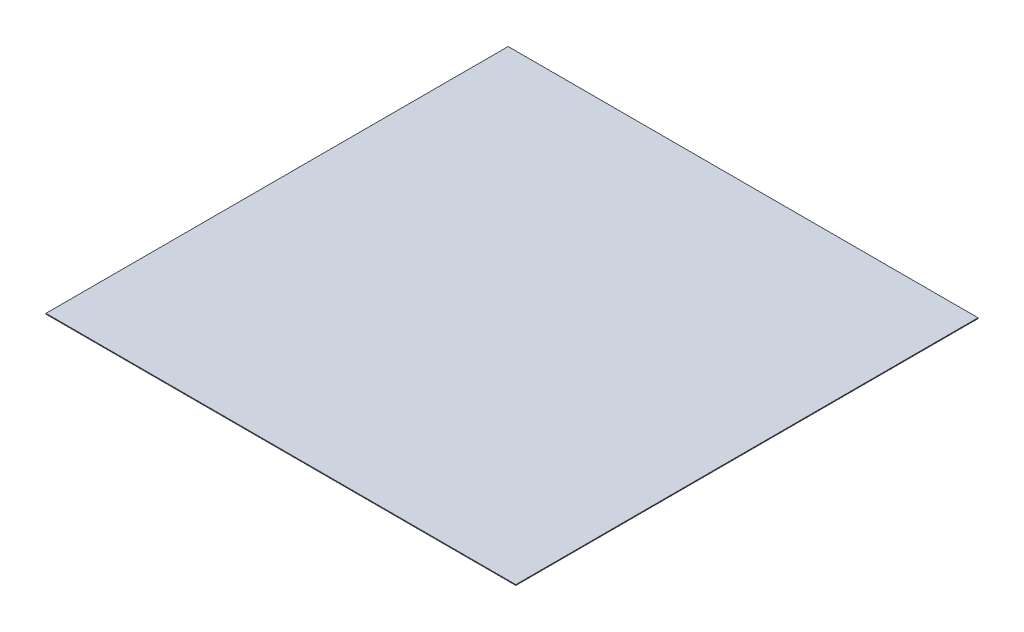
ISO-10303-21;
HEADER;
FILE_DESCRIPTION(('STEP AP214'),'2;1');
FILE_NAME('part.step','',(''),(''),'','','');
FILE_SCHEMA(('AUTOMOTIVE_DESIGN { 1 0 10303 214 1 1 1 1 }'));
ENDSEC;
DATA;
#1=APPLICATION_CONTEXT('core data for automotive mechanical design processes');
#2=APPLICATION_PROTOCOL_DEFINITION('international standard','automotive_design',2000,#1);
#3=PRODUCT_CONTEXT('',#1,'mechanical');
#4=PRODUCT('Part','Part','',(#3));
#5=PRODUCT_RELATED_PRODUCT_CATEGORY('part','',(#4));
#6=PRODUCT_DEFINITION_FORMATION('','',#4);
#7=PRODUCT_DEFINITION_CONTEXT('part definition',#1,'design');
#8=PRODUCT_DEFINITION('design','',#6,#7);
#9=PRODUCT_DEFINITION_SHAPE('','',#8);
#10=(LENGTH_UNIT() NAMED_UNIT(*) SI_UNIT(.MILLI.,.METRE.));
#11=(NAMED_UNIT(*) PLANE_ANGLE_UNIT() SI_UNIT($,.RADIAN.));
#12=(NAMED_UNIT(*) SI_UNIT($,.STERADIAN.) SOLID_ANGLE_UNIT());
#13=UNCERTAINTY_MEASURE_WITH_UNIT(LENGTH_MEASURE(1.E-05),#10,'distance_accuracy_value','');
#14=(GEOMETRIC_REPRESENTATION_CONTEXT(3) GLOBAL_UNCERTAINTY_ASSIGNED_CONTEXT((#13)) GLOBAL_UNIT_ASSIGNED_CONTEXT((#10,
#11,#12)) REPRESENTATION_CONTEXT('',''));
#15=CARTESIAN_POINT('',(0.,0.,0.));
#16=DIRECTION('',(0.,0.,1.));
#17=DIRECTION('',(1.,0.,0.));
#18=AXIS2_PLACEMENT_3D('',#15,#16,#17);
#19=CARTESIAN_POINT('',(610.,2.,600.));
#20=DIRECTION('',(-1.,0.,0.));
#21=DIRECTION('',(0.,0.,1.));
#22=AXIS2_PLACEMENT_3D('',#19,#20,#21);
#23=PLANE('',#22);
#24=DIRECTION('',(0.,0.,-1.));
#25=VECTOR('',#24,1.);
#26=CARTESIAN_POINT('',(610.,0.,600.));
#27=LINE('',#26,#25);
#28=CARTESIAN_POINT('',(610.,0.,600.));
#29=VERTEX_POINT('',#28);
#30=CARTESIAN_POINT('',(610.,0.,-600.));
#31=VERTEX_POINT('',#30);
#32=EDGE_CURVE('E96',#29,#31,#27,.T.);
#33=ORIENTED_EDGE('',*,*,#32,.T.);
#34=DIRECTION('',(0.,-1.,0.));
#35=VECTOR('',#34,1.);
#36=CARTESIAN_POINT('',(610.,2.,-600.));
#37=LINE('',#36,#35);
#38=CARTESIAN_POINT('',(610.,2.,-600.));
#39=VERTEX_POINT('',#38);
#40=EDGE_CURVE('E11',#39,#31,#37,.T.);
#41=ORIENTED_EDGE('',*,*,#40,.F.);
#42=DIRECTION('',(0.,0.,-1.));
#43=VECTOR('',#42,1.);
#44=CARTESIAN_POINT('',(610.,2.,600.));
#45=LINE('',#44,#43);
#46=CARTESIAN_POINT('',(610.,2.,600.));
#47=VERTEX_POINT('',#46);
#48=EDGE_CURVE('E84',#47,#39,#45,.T.);
#49=ORIENTED_EDGE('',*,*,#48,.F.);
#50=DIRECTION('',(0.,-1.,0.));
#51=VECTOR('',#50,1.);
#52=CARTESIAN_POINT('',(610.,2.,600.));
#53=LINE('',#52,#51);
#54=EDGE_CURVE('E92',#47,#29,#53,.T.);
#55=ORIENTED_EDGE('',*,*,#54,.T.);
#56=EDGE_LOOP('',(#33,#41,#49,#55));
#57=FACE_BOUND('',#56,.T.);
#58=ADVANCED_FACE('F33',(#57),#23,.F.);
#59=CARTESIAN_POINT('',(-610.,2.,-600.));
#60=DIRECTION('',(0.,0.,1.));
#61=DIRECTION('',(1.,0.,0.));
#62=AXIS2_PLACEMENT_3D('',#59,#60,#61);
#63=PLANE('',#62);
#64=DIRECTION('',(-1.,0.,0.));
#65=VECTOR('',#64,1.);
#66=CARTESIAN_POINT('',(-610.,0.,-600.));
#67=LINE('',#66,#65);
#68=CARTESIAN_POINT('',(-610.,0.,-600.));
#69=VERTEX_POINT('',#68);
#70=EDGE_CURVE('E88',#31,#69,#67,.T.);
#71=ORIENTED_EDGE('',*,*,#70,.T.);
#72=DIRECTION('',(0.,-1.,0.));
#73=VECTOR('',#72,1.);
#74=CARTESIAN_POINT('',(-610.,2.,-600.));
#75=LINE('',#74,#73);
#76=CARTESIAN_POINT('',(-610.,2.,-600.));
#77=VERTEX_POINT('',#76);
#78=EDGE_CURVE('E41',#77,#69,#75,.T.);
#79=ORIENTED_EDGE('',*,*,#78,.F.);
#80=DIRECTION('',(-1.,0.,0.));
#81=VECTOR('',#80,1.);
#82=CARTESIAN_POINT('',(-610.,2.,-600.));
#83=LINE('',#82,#81);
#84=EDGE_CURVE('E79',#39,#77,#83,.T.);
#85=ORIENTED_EDGE('',*,*,#84,.F.);
#86=ORIENTED_EDGE('',*,*,#40,.T.);
#87=EDGE_LOOP('',(#71,#79,#85,#86));
#88=FACE_BOUND('',#87,.T.);
#89=ADVANCED_FACE('F87',(#88),#63,.F.);
#90=CARTESIAN_POINT('',(-610.,2.,600.));
#91=DIRECTION('',(1.,0.,0.));
#92=DIRECTION('',(0.,0.,-1.));
#93=AXIS2_PLACEMENT_3D('',#90,#91,#92);
#94=PLANE('',#93);
#95=DIRECTION('',(0.,0.,1.));
#96=VECTOR('',#95,1.);
#97=CARTESIAN_POINT('',(-610.,0.,600.));
#98=LINE('',#97,#96);
#99=CARTESIAN_POINT('',(-610.,0.,600.));
#100=VERTEX_POINT('',#99);
#101=EDGE_CURVE('E66',#69,#100,#98,.T.);
#102=ORIENTED_EDGE('',*,*,#101,.T.);
#103=DIRECTION('',(0.,-1.,0.));
#104=VECTOR('',#103,1.);
#105=CARTESIAN_POINT('',(-610.,2.,600.));
#106=LINE('',#105,#104);
#107=CARTESIAN_POINT('',(-610.,2.,600.));
#108=VERTEX_POINT('',#107);
#109=EDGE_CURVE('E89',#108,#100,#106,.T.);
#110=ORIENTED_EDGE('',*,*,#109,.F.);
#111=DIRECTION('',(0.,0.,1.));
#112=VECTOR('',#111,1.);
#113=CARTESIAN_POINT('',(-610.,2.,600.));
#114=LINE('',#113,#112);
#115=EDGE_CURVE('E82',#77,#108,#114,.T.);
#116=ORIENTED_EDGE('',*,*,#115,.F.);
#117=ORIENTED_EDGE('',*,*,#78,.T.);
#118=EDGE_LOOP('',(#102,#110,#116,#117));
#119=FACE_BOUND('',#118,.T.);
#120=ADVANCED_FACE('F90',(#119),#94,.F.);
#121=CARTESIAN_POINT('',(-610.,2.,600.));
#122=DIRECTION('',(0.,0.,-1.));
#123=DIRECTION('',(-1.,0.,0.));
#124=AXIS2_PLACEMENT_3D('',#121,#122,#123);
#125=PLANE('',#124);
#126=DIRECTION('',(1.,0.,0.));
#127=VECTOR('',#126,1.);
#128=CARTESIAN_POINT('',(-610.,0.,600.));
#129=LINE('',#128,#127);
#130=EDGE_CURVE('E72',#100,#29,#129,.T.);
#131=ORIENTED_EDGE('',*,*,#130,.T.);
#132=ORIENTED_EDGE('',*,*,#54,.F.);
#133=DIRECTION('',(1.,0.,0.));
#134=VECTOR('',#133,1.);
#135=CARTESIAN_POINT('',(-610.,2.,600.));
#136=LINE('',#135,#134);
#137=EDGE_CURVE('E49',#108,#47,#136,.T.);
#138=ORIENTED_EDGE('',*,*,#137,.F.);
#139=ORIENTED_EDGE('',*,*,#109,.T.);
#140=EDGE_LOOP('',(#131,#132,#138,#139));
#141=FACE_BOUND('',#140,.T.);
#142=ADVANCED_FACE('F103',(#141),#125,.F.);
#143=CARTESIAN_POINT('',(0.,2.,0.));
#144=DIRECTION('',(0.,-1.,0.));
#145=DIRECTION('',(0.,0.,-1.));
#146=AXIS2_PLACEMENT_3D('',#143,#144,#145);
#147=PLANE('',#146);
#148=ORIENTED_EDGE('',*,*,#48,.T.);
#149=ORIENTED_EDGE('',*,*,#84,.T.);
#150=ORIENTED_EDGE('',*,*,#115,.T.);
#151=ORIENTED_EDGE('',*,*,#137,.T.);
#152=EDGE_LOOP('',(#148,#149,#150,#151));
#153=FACE_BOUND('',#152,.T.);
#154=ADVANCED_FACE('F80',(#153),#147,.F.);
#155=CARTESIAN_POINT('',(0.,0.,0.));
#156=DIRECTION('',(0.,-1.,0.));
#157=DIRECTION('',(0.,0.,-1.));
#158=AXIS2_PLACEMENT_3D('',#155,#156,#157);
#159=PLANE('',#158);
#160=ORIENTED_EDGE('',*,*,#32,.F.);
#161=ORIENTED_EDGE('',*,*,#130,.F.);
#162=ORIENTED_EDGE('',*,*,#101,.F.);
#163=ORIENTED_EDGE('',*,*,#70,.F.);
#164=EDGE_LOOP('',(#160,#161,#162,#163));
#165=FACE_BOUND('',#164,.T.);
#166=ADVANCED_FACE('F106',(#165),#159,.T.);
#167=CLOSED_SHELL('',(#58,#89,#120,#142,#154,#166));
#168=MANIFOLD_SOLID_BREP('B2',#167);
#169=ADVANCED_BREP_SHAPE_REPRESENTATION('',(#18,#168),#14);
#170=SHAPE_DEFINITION_REPRESENTATION(#9,#169);
ENDSEC;
END-ISO-10303-21;
